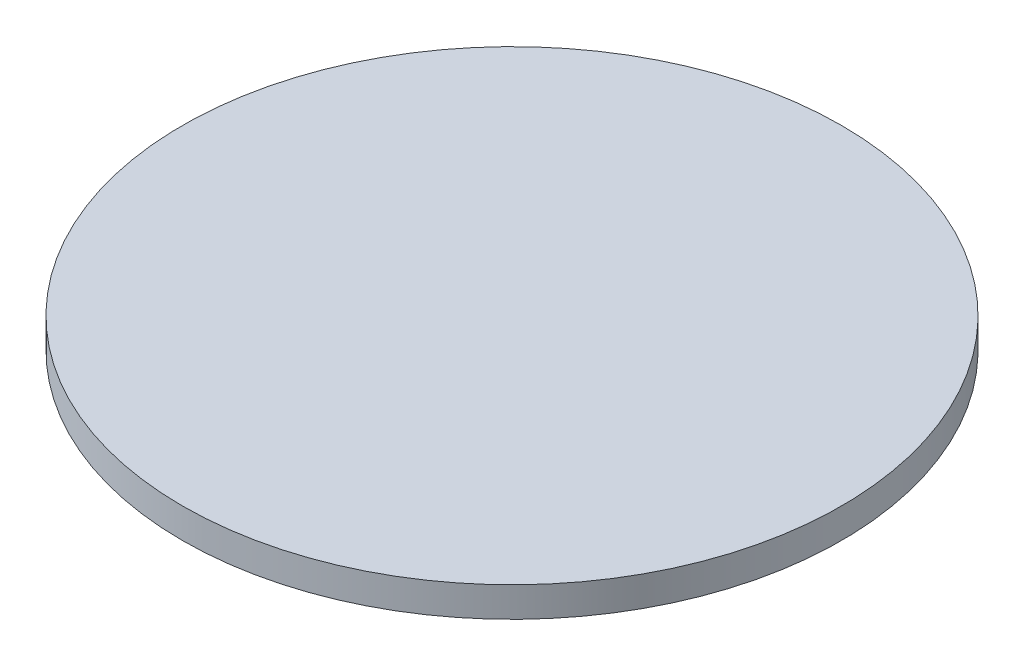
ISO-10303-21;
HEADER;
FILE_DESCRIPTION(('STEP AP214'),'2;1');
FILE_NAME('part.step','',(''),(''),'','','');
FILE_SCHEMA(('AUTOMOTIVE_DESIGN { 1 0 10303 214 1 1 1 1 }'));
ENDSEC;
DATA;
#1=APPLICATION_CONTEXT('core data for automotive mechanical design processes');
#2=APPLICATION_PROTOCOL_DEFINITION('international standard','automotive_design',2000,#1);
#3=PRODUCT_CONTEXT('',#1,'mechanical');
#4=PRODUCT('Part','Part','',(#3));
#5=PRODUCT_RELATED_PRODUCT_CATEGORY('part','',(#4));
#6=PRODUCT_DEFINITION_FORMATION('','',#4);
#7=PRODUCT_DEFINITION_CONTEXT('part definition',#1,'design');
#8=PRODUCT_DEFINITION('design','',#6,#7);
#9=PRODUCT_DEFINITION_SHAPE('','',#8);
#10=(LENGTH_UNIT() NAMED_UNIT(*) SI_UNIT(.MILLI.,.METRE.));
#11=(NAMED_UNIT(*) PLANE_ANGLE_UNIT() SI_UNIT($,.RADIAN.));
#12=(NAMED_UNIT(*) SI_UNIT($,.STERADIAN.) SOLID_ANGLE_UNIT());
#13=UNCERTAINTY_MEASURE_WITH_UNIT(LENGTH_MEASURE(1.E-05),#10,'distance_accuracy_value','');
#14=(GEOMETRIC_REPRESENTATION_CONTEXT(3) GLOBAL_UNCERTAINTY_ASSIGNED_CONTEXT((#13)) GLOBAL_UNIT_ASSIGNED_CONTEXT((#10,
#11,#12)) REPRESENTATION_CONTEXT('',''));
#15=CARTESIAN_POINT('',(0.,0.,0.));
#16=DIRECTION('',(0.,0.,1.));
#17=DIRECTION('',(1.,0.,0.));
#18=AXIS2_PLACEMENT_3D('',#15,#16,#17);
#19=CARTESIAN_POINT('',(0.,3.,0.));
#20=DIRECTION('',(0.,-1.,0.));
#21=DIRECTION('',(0.,0.,-1.));
#22=AXIS2_PLACEMENT_3D('',#19,#20,#21);
#23=CYLINDRICAL_SURFACE('',#22,33.);
#24=CARTESIAN_POINT('',(0.,3.,0.));
#25=DIRECTION('',(0.,1.,0.));
#26=DIRECTION('',(0.,0.,1.));
#27=AXIS2_PLACEMENT_3D('',#24,#25,#26);
#28=CIRCLE('',#27,33.);
#29=CARTESIAN_POINT('',(0.,3.,33.));
#30=VERTEX_POINT('',#29);
#31=EDGE_CURVE('E10',#30,#30,#28,.T.);
#32=ORIENTED_EDGE('',*,*,#31,.F.);
#33=EDGE_LOOP('',(#32));
#34=FACE_BOUND('',#33,.T.);
#35=CARTESIAN_POINT('',(0.,0.,0.));
#36=DIRECTION('',(0.,1.,0.));
#37=DIRECTION('',(0.,0.,1.));
#38=AXIS2_PLACEMENT_3D('',#35,#36,#37);
#39=CIRCLE('',#38,33.);
#40=CARTESIAN_POINT('',(0.,0.,33.));
#41=VERTEX_POINT('',#40);
#42=EDGE_CURVE('E40',#41,#41,#39,.T.);
#43=ORIENTED_EDGE('',*,*,#42,.T.);
#44=EDGE_LOOP('',(#43));
#45=FACE_BOUND('',#44,.T.);
#46=ADVANCED_FACE('F37',(#34,#45),#23,.T.);
#47=CARTESIAN_POINT('',(0.,3.,0.));
#48=DIRECTION('',(0.,1.,0.));
#49=DIRECTION('',(0.,0.,1.));
#50=AXIS2_PLACEMENT_3D('',#47,#48,#49);
#51=PLANE('',#50);
#52=ORIENTED_EDGE('',*,*,#31,.T.);
#53=EDGE_LOOP('',(#52));
#54=FACE_BOUND('',#53,.T.);
#55=ADVANCED_FACE('F54',(#54),#51,.T.);
#56=CARTESIAN_POINT('',(0.,0.,0.));
#57=DIRECTION('',(0.,1.,0.));
#58=DIRECTION('',(0.,0.,1.));
#59=AXIS2_PLACEMENT_3D('',#56,#57,#58);
#60=PLANE('',#59);
#61=ORIENTED_EDGE('',*,*,#42,.F.);
#62=EDGE_LOOP('',(#61));
#63=FACE_BOUND('',#62,.T.);
#64=ADVANCED_FACE('F52',(#63),#60,.F.);
#65=CLOSED_SHELL('',(#46,#55,#64));
#66=MANIFOLD_SOLID_BREP('B2',#65);
#67=ADVANCED_BREP_SHAPE_REPRESENTATION('',(#18,#66),#14);
#68=SHAPE_DEFINITION_REPRESENTATION(#9,#67);
ENDSEC;
END-ISO-10303-21;
